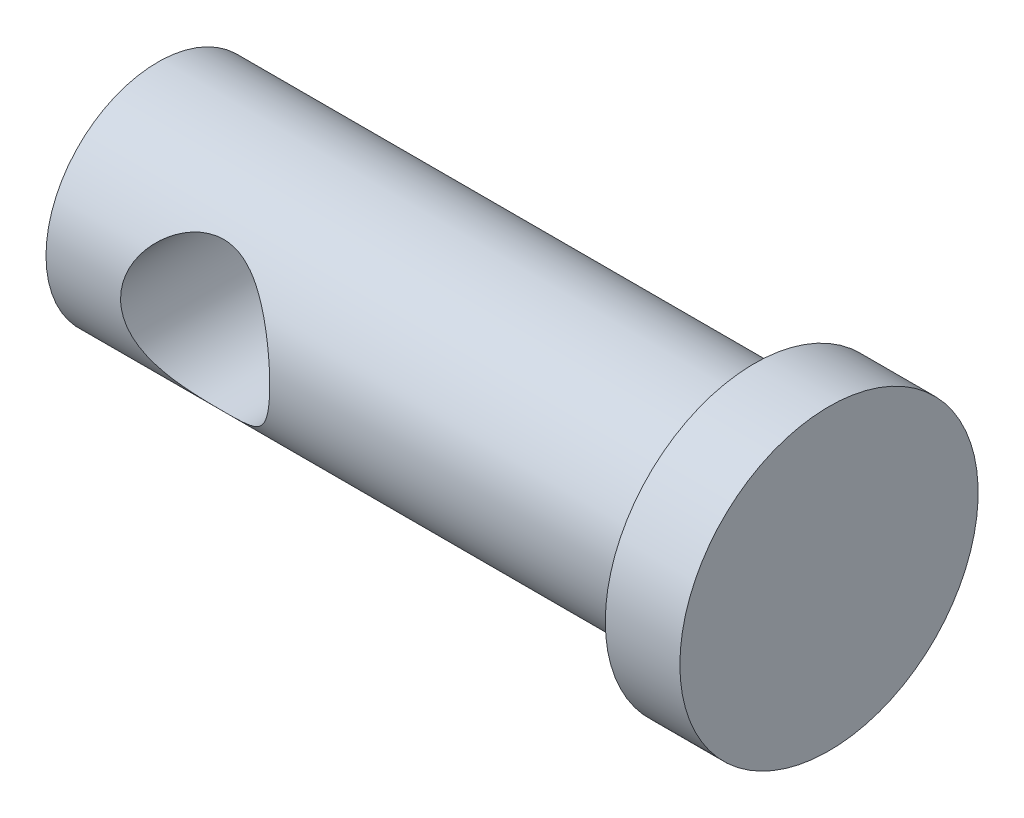
ISO-10303-21;
HEADER;
FILE_DESCRIPTION(('STEP AP214'),'2;1');
FILE_NAME('part.step','',(''),(''),'','','');
FILE_SCHEMA(('AUTOMOTIVE_DESIGN { 1 0 10303 214 1 1 1 1 }'));
ENDSEC;
DATA;
#1=APPLICATION_CONTEXT('core data for automotive mechanical design processes');
#2=APPLICATION_PROTOCOL_DEFINITION('international standard','automotive_design',2000,#1);
#3=PRODUCT_CONTEXT('',#1,'mechanical');
#4=PRODUCT('Part','Part','',(#3));
#5=PRODUCT_RELATED_PRODUCT_CATEGORY('part','',(#4));
#6=PRODUCT_DEFINITION_FORMATION('','',#4);
#7=PRODUCT_DEFINITION_CONTEXT('part definition',#1,'design');
#8=PRODUCT_DEFINITION('design','',#6,#7);
#9=PRODUCT_DEFINITION_SHAPE('','',#8);
#10=(LENGTH_UNIT() NAMED_UNIT(*) SI_UNIT(.MILLI.,.METRE.));
#11=(NAMED_UNIT(*) PLANE_ANGLE_UNIT() SI_UNIT($,.RADIAN.));
#12=(NAMED_UNIT(*) SI_UNIT($,.STERADIAN.) SOLID_ANGLE_UNIT());
#13=UNCERTAINTY_MEASURE_WITH_UNIT(LENGTH_MEASURE(1.E-05),#10,'distance_accuracy_value','');
#14=(GEOMETRIC_REPRESENTATION_CONTEXT(3) GLOBAL_UNCERTAINTY_ASSIGNED_CONTEXT((#13)) GLOBAL_UNIT_ASSIGNED_CONTEXT((#10,
#11,#12)) REPRESENTATION_CONTEXT('',''));
#15=CARTESIAN_POINT('',(0.,0.,0.));
#16=DIRECTION('',(0.,0.,1.));
#17=DIRECTION('',(1.,0.,0.));
#18=AXIS2_PLACEMENT_3D('',#15,#16,#17);
#19=CARTESIAN_POINT('',(0.,0.,0.));
#20=DIRECTION('',(-1.,0.,0.));
#21=DIRECTION('',(0.,0.,1.));
#22=AXIS2_PLACEMENT_3D('',#19,#20,#21);
#23=PLANE('',#22);
#24=CARTESIAN_POINT('',(0.,0.,0.));
#25=DIRECTION('',(-1.,0.,0.));
#26=DIRECTION('',(0.,0.,1.));
#27=AXIS2_PLACEMENT_3D('',#24,#25,#26);
#28=CIRCLE('',#27,2.);
#29=CARTESIAN_POINT('',(0.,0.,2.));
#30=VERTEX_POINT('',#29);
#31=EDGE_CURVE('E10',#30,#30,#28,.T.);
#32=ORIENTED_EDGE('',*,*,#31,.F.);
#33=EDGE_LOOP('',(#32));
#34=FACE_BOUND('',#33,.T.);
#35=ADVANCED_FACE('F43',(#34),#23,.F.);
#36=CARTESIAN_POINT('',(-9.,0.,0.));
#37=DIRECTION('',(-1.,0.,0.));
#38=DIRECTION('',(0.,0.,1.));
#39=AXIS2_PLACEMENT_3D('',#36,#37,#38);
#40=CYLINDRICAL_SURFACE('',#39,2.);
#41=CARTESIAN_POINT('',(-1.,0.,0.));
#42=DIRECTION('',(-1.,0.,0.));
#43=DIRECTION('',(0.,0.,1.));
#44=AXIS2_PLACEMENT_3D('',#41,#42,#43);
#45=CIRCLE('',#44,2.);
#46=CARTESIAN_POINT('',(-1.,0.,2.));
#47=VERTEX_POINT('',#46);
#48=EDGE_CURVE('E56',#47,#47,#45,.T.);
#49=ORIENTED_EDGE('',*,*,#48,.F.);
#50=EDGE_LOOP('',(#49));
#51=FACE_BOUND('',#50,.T.);
#52=ORIENTED_EDGE('',*,*,#31,.T.);
#53=EDGE_LOOP('',(#52));
#54=FACE_BOUND('',#53,.T.);
#55=ADVANCED_FACE('F91',(#51,#54),#40,.T.);
#56=CARTESIAN_POINT('',(-1.,2.,0.));
#57=DIRECTION('',(1.,0.,0.));
#58=DIRECTION('',(0.,0.,-1.));
#59=AXIS2_PLACEMENT_3D('',#56,#57,#58);
#60=PLANE('',#59);
#61=CARTESIAN_POINT('',(-1.,0.,0.));
#62=DIRECTION('',(-1.,0.,0.));
#63=DIRECTION('',(0.,0.,1.));
#64=AXIS2_PLACEMENT_3D('',#61,#62,#63);
#65=CIRCLE('',#64,1.5);
#66=CARTESIAN_POINT('',(-1.,0.,1.5));
#67=VERTEX_POINT('',#66);
#68=EDGE_CURVE('E62',#67,#67,#65,.T.);
#69=ORIENTED_EDGE('',*,*,#68,.F.);
#70=EDGE_LOOP('',(#69));
#71=FACE_BOUND('',#70,.T.);
#72=ORIENTED_EDGE('',*,*,#48,.T.);
#73=EDGE_LOOP('',(#72));
#74=FACE_BOUND('',#73,.T.);
#75=ADVANCED_FACE('F87',(#71,#74),#60,.F.);
#76=CARTESIAN_POINT('',(-9.,0.,0.));
#77=DIRECTION('',(-1.,0.,0.));
#78=DIRECTION('',(0.,0.,1.));
#79=AXIS2_PLACEMENT_3D('',#76,#77,#78);
#80=CYLINDRICAL_SURFACE('',#79,1.5);
#81=CARTESIAN_POINT('',(-6.,0.,1.5));
#82=CARTESIAN_POINT('',(-5.99999972518375,-0.050242358334064,1.50000020822414));
#83=CARTESIAN_POINT('',(-6.00380698497775,-0.100484543566457,1.49745401376692));
#84=CARTESIAN_POINT('',(-6.01879843205283,-0.199366529015833,1.48752326211906));
#85=CARTESIAN_POINT('',(-6.02998612156165,-0.248005556977501,1.48013640790618));
#86=CARTESIAN_POINT('',(-6.05905385866242,-0.342106153927126,1.46125241202353));
#87=CARTESIAN_POINT('',(-6.07690257000397,-0.387581436328777,1.44977452746657));
#88=CARTESIAN_POINT('',(-6.11853168163575,-0.474707645498629,1.4236306893872));
#89=CARTESIAN_POINT('',(-6.14231294315028,-0.516358015804834,1.40896427302755));
#90=CARTESIAN_POINT('',(-6.19732846868372,-0.598642350385054,1.37613664684919));
#91=CARTESIAN_POINT('',(-6.22902393037145,-0.638890152730337,1.3577844878966));
#92=CARTESIAN_POINT('',(-6.29786502432923,-0.713864022346369,1.31991156541733));
#93=CARTESIAN_POINT('',(-6.33501846491887,-0.748582027719439,1.30038915178416));
#94=CARTESIAN_POINT('',(-6.42052618380634,-0.81711148872748,1.25864132339397));
#95=CARTESIAN_POINT('',(-6.46972282660172,-0.849915931813755,1.23647533968899));
#96=CARTESIAN_POINT('',(-6.57418168882327,-0.906751785070868,1.19542073676408));
#97=CARTESIAN_POINT('',(-6.62943320078139,-0.930798367132494,1.17652647977327));
#98=CARTESIAN_POINT('',(-6.7283556467108,-0.963370175057203,1.14988133320735));
#99=CARTESIAN_POINT('',(-6.77076422643691,-0.974372236180082,1.14048813946218));
#100=CARTESIAN_POINT('',(-6.85737225237087,-0.9907530889261,1.12628984829786));
#101=CARTESIAN_POINT('',(-6.90156847436319,-0.99614157325966,1.12147684372013));
#102=CARTESIAN_POINT('',(-6.99073738942808,-1.00095682070629,1.11718302804083));
#103=CARTESIAN_POINT('',(-7.0357125117256,-1.0003592145882,1.11772401279478));
#104=CARTESIAN_POINT('',(-7.12481748675048,-0.993187906666194,1.12409887741485));
#105=CARTESIAN_POINT('',(-7.16894659101632,-0.986609141899783,1.12993724142592));
#106=CARTESIAN_POINT('',(-7.25323352561879,-0.968324971088712,1.14563592995791));
#107=CARTESIAN_POINT('',(-7.29348066796153,-0.956858557405003,1.15530744165153));
#108=CARTESIAN_POINT('',(-7.37151184549576,-0.929350592909501,1.17754811463845));
#109=CARTESIAN_POINT('',(-7.40929506514863,-0.913307536614354,1.19011822916388));
#110=CARTESIAN_POINT('',(-7.48951269764114,-0.873369093698318,1.21982098202212));
#111=CARTESIAN_POINT('',(-7.53132995009406,-0.848540261643842,1.23736158924507));
#112=CARTESIAN_POINT('',(-7.61069169749191,-0.793344802336528,1.27345768922483));
#113=CARTESIAN_POINT('',(-7.64823082883713,-0.762971345040337,1.29201441370946));
#114=CARTESIAN_POINT('',(-7.72627127285557,-0.689905826559709,1.33271671862096));
#115=CARTESIAN_POINT('',(-7.7656670243557,-0.645969691404497,1.35477372355024));
#116=CARTESIAN_POINT('',(-7.83659824725494,-0.551003999553807,1.39609050337857));
#117=CARTESIAN_POINT('',(-7.86814107270105,-0.499981149675161,1.41535288825285));
#118=CARTESIAN_POINT('',(-7.91673885931421,-0.402428913545598,1.44572702044166));
#119=CARTESIAN_POINT('',(-7.93542168167021,-0.356978821685239,1.45769630582498));
#120=CARTESIAN_POINT('',(-7.96605246281194,-0.263018021968452,1.47753859515521));
#121=CARTESIAN_POINT('',(-7.97800611356591,-0.214509939501016,1.48541506063844));
#122=CARTESIAN_POINT('',(-7.9945805826192,-0.115492726585945,1.49637941078331));
#123=CARTESIAN_POINT('',(-7.99916973046918,-0.0649759059670213,1.49944661230576));
#124=CARTESIAN_POINT('',(-8.00062354428105,0.036220759694619,1.50041557482591));
#125=CARTESIAN_POINT('',(-7.99748875024439,0.0869005930932839,1.49831769692815));
#126=CARTESIAN_POINT('',(-7.98418797221902,0.183227858602149,1.48949794712138));
#127=CARTESIAN_POINT('',(-7.97453135112234,0.228978722339657,1.48311123195135));
#128=CARTESIAN_POINT('',(-7.94920215699362,0.318058196213642,1.46659224642396));
#129=CARTESIAN_POINT('',(-7.9335286245361,0.361386418785357,1.45645937873408));
#130=CARTESIAN_POINT('',(-7.89567385147732,0.447332375233223,1.4324817626467));
#131=CARTESIAN_POINT('',(-7.87315592295824,0.489748092316566,1.41844935068245));
#132=CARTESIAN_POINT('',(-7.8227833550277,0.570341511977792,1.38800927805403));
#133=CARTESIAN_POINT('',(-7.79492541973703,0.608516574097257,1.37160015200651));
#134=CARTESIAN_POINT('',(-7.72969606591763,0.685927227415325,1.33477273328242));
#135=CARTESIAN_POINT('',(-7.69151686994798,0.724375937862667,1.31413078406202));
#136=CARTESIAN_POINT('',(-7.60944428503593,0.794669840332394,1.27285586536854));
#137=CARTESIAN_POINT('',(-7.5655469805006,0.826510468230435,1.25222291185946));
#138=CARTESIAN_POINT('',(-7.4764287935708,0.880623882794764,1.21469839506517));
#139=CARTESIAN_POINT('',(-7.43163398310014,0.903478180804395,1.19763798588661));
#140=CARTESIAN_POINT('',(-7.33806367360943,0.942481068876252,1.16719487207113));
#141=CARTESIAN_POINT('',(-7.2892955308023,0.958641728453859,1.1538055628277));
#142=CARTESIAN_POINT('',(-7.19771775643295,0.981179217293119,1.13466604076532));
#143=CARTESIAN_POINT('',(-7.15541409507053,0.988792987823092,1.12797499006895));
#144=CARTESIAN_POINT('',(-7.06971335933228,0.998496029624887,1.11939733222928));
#145=CARTESIAN_POINT('',(-7.02631752442677,1.00059130142516,1.11750550674066));
#146=CARTESIAN_POINT('',(-6.93967847164164,0.999119609907757,1.11882100574833));
#147=CARTESIAN_POINT('',(-6.89643535931854,0.995549293852656,1.12203134956833));
#148=CARTESIAN_POINT('',(-6.81132823572852,0.982984986109971,1.1330522619864));
#149=CARTESIAN_POINT('',(-6.76946614306962,0.97398375858765,1.14086896751217));
#150=CARTESIAN_POINT('',(-6.67714440678569,0.947965178356308,1.1626342196827));
#151=CARTESIAN_POINT('',(-6.62736614363047,0.929450935941993,1.17766166854602));
#152=CARTESIAN_POINT('',(-6.53225658291059,0.885422631474873,1.21111080629161));
#153=CARTESIAN_POINT('',(-6.48693165103157,0.85989874178542,1.22953724861882));
#154=CARTESIAN_POINT('',(-6.40035905640316,0.801991402694657,1.26808593269725));
#155=CARTESIAN_POINT('',(-6.35920062728075,0.769491549448271,1.2882329369107));
#156=CARTESIAN_POINT('',(-6.28233876087877,0.698358840177308,1.32814150773993));
#157=CARTESIAN_POINT('',(-6.24663700148759,0.659724105134951,1.3479029541764));
#158=CARTESIAN_POINT('',(-6.17664394784294,0.570728664877768,1.38815775980392));
#159=CARTESIAN_POINT('',(-6.14329067991017,0.519480834775986,1.40834902724558));
#160=CARTESIAN_POINT('',(-6.08604336166802,0.410434277887489,1.44388832937518));
#161=CARTESIAN_POINT('',(-6.06213444658818,0.352646031225022,1.45924396722731));
#162=CARTESIAN_POINT('',(-6.02942271091799,0.245717534917525,1.48050822418367));
#163=CARTESIAN_POINT('',(-6.01844448045066,0.197506162628867,1.48775740184446));
#164=CARTESIAN_POINT('',(-6.00373598373099,0.0995290060120649,1.49750140070948));
#165=CARTESIAN_POINT('',(-6.000000272202,0.0497644180940285,1.49999979375663));
#166=CARTESIAN_POINT('',(-6.,0.,1.5));
#167=B_SPLINE_CURVE_WITH_KNOTS('',3,(#81,#82,#83,#84,#85,#86,#87,#88,#89,#90,#91,#92,#93,#94,
#95,#96,#97,#98,#99,#100,#101,#102,#103,#104,#105,#106,#107,#108,#109,#110,#111,#112,#113,#114,
#115,#116,#117,#118,#119,#120,#121,#122,#123,#124,#125,#126,#127,#128,#129,#130,#131,#132,#133,
#134,#135,#136,#137,#138,#139,#140,#141,#142,#143,#144,#145,#146,#147,#148,#149,#150,#151,#152,
#153,#154,#155,#156,#157,#158,#159,#160,#161,#162,#163,#164,#165,#166),.UNSPECIFIED.,.T.,.F.,(4,
2,2,2,2,2,2,2,2,2,2,2,2,2,2,2,2,2,2,2,2,2,2,2,2,2,2,2,2,2,2,2,2,2,2,2,2,2,2,2,2,2,4),(0.,
0.1505266132527,0.301124707174344,0.451023076595115,0.600943219336932,0.763585145002783,
0.926462058021592,1.11503341647991,1.30327652722719,1.43716846838015,1.57082883922905,
1.70503355867689,1.83935198631676,1.96774431099011,2.09617891902539,2.25073787329797,
2.40548851889212,2.5935947724756,2.78152420149865,2.93262043847563,3.08358867570591,
3.23520441646309,3.38680955765891,3.5277654239542,3.66874377568319,3.81826173413942,
3.96787227471786,4.1411408806983,4.31452876587063,4.47324967649701,4.63168313315306,
4.76162024003012,4.8914160016149,5.02128860137217,5.15133461921144,5.31603304346011,
5.48096356682587,5.64889622595852,5.81688041978686,6.00897675773024,6.20076953274023,
6.34997645676982,6.49907115623393),.UNSPECIFIED.);
#168=CARTESIAN_POINT('',(-6.,0.,1.5));
#169=VERTEX_POINT('',#168);
#170=EDGE_CURVE('E46',#169,#169,#167,.T.);
#171=ORIENTED_EDGE('',*,*,#170,.T.);
#172=EDGE_LOOP('',(#171));
#173=FACE_BOUND('',#172,.T.);
#174=CARTESIAN_POINT('',(-6.,0.,-1.5));
#175=CARTESIAN_POINT('',(-5.99999972518375,0.050242358334064,-1.50000020822414));
#176=CARTESIAN_POINT('',(-6.00380698497775,0.100484543566457,-1.49745401376692));
#177=CARTESIAN_POINT('',(-6.01879843205283,0.199366529015833,-1.48752326211906));
#178=CARTESIAN_POINT('',(-6.02998612156165,0.248005556977501,-1.48013640790618));
#179=CARTESIAN_POINT('',(-6.05905385866242,0.342106153927126,-1.46125241202353));
#180=CARTESIAN_POINT('',(-6.07690257000397,0.387581436328777,-1.44977452746657));
#181=CARTESIAN_POINT('',(-6.11853168163575,0.474707645498629,-1.4236306893872));
#182=CARTESIAN_POINT('',(-6.14231294315028,0.516358015804834,-1.40896427302755));
#183=CARTESIAN_POINT('',(-6.19732846868372,0.598642350385054,-1.37613664684919));
#184=CARTESIAN_POINT('',(-6.22902393037145,0.638890152730337,-1.3577844878966));
#185=CARTESIAN_POINT('',(-6.29786502432923,0.713864022346369,-1.31991156541733));
#186=CARTESIAN_POINT('',(-6.33501846491887,0.748582027719439,-1.30038915178416));
#187=CARTESIAN_POINT('',(-6.42052618380634,0.81711148872748,-1.25864132339397));
#188=CARTESIAN_POINT('',(-6.46972282660172,0.849915931813755,-1.23647533968899));
#189=CARTESIAN_POINT('',(-6.57418168882327,0.906751785070868,-1.19542073676408));
#190=CARTESIAN_POINT('',(-6.62943320078139,0.930798367132494,-1.17652647977327));
#191=CARTESIAN_POINT('',(-6.7283556467108,0.963370175057203,-1.14988133320735));
#192=CARTESIAN_POINT('',(-6.77076422643691,0.974372236180082,-1.14048813946218));
#193=CARTESIAN_POINT('',(-6.85737225237087,0.9907530889261,-1.12628984829786));
#194=CARTESIAN_POINT('',(-6.90156847436319,0.99614157325966,-1.12147684372013));
#195=CARTESIAN_POINT('',(-6.99073738942808,1.00095682070629,-1.11718302804083));
#196=CARTESIAN_POINT('',(-7.0357125117256,1.0003592145882,-1.11772401279478));
#197=CARTESIAN_POINT('',(-7.12481748675048,0.993187906666194,-1.12409887741485));
#198=CARTESIAN_POINT('',(-7.16894659101632,0.986609141899783,-1.12993724142592));
#199=CARTESIAN_POINT('',(-7.25323352561879,0.968324971088712,-1.14563592995791));
#200=CARTESIAN_POINT('',(-7.29348066796153,0.956858557405003,-1.15530744165153));
#201=CARTESIAN_POINT('',(-7.37151184549576,0.929350592909501,-1.17754811463845));
#202=CARTESIAN_POINT('',(-7.40929506514863,0.913307536614354,-1.19011822916388));
#203=CARTESIAN_POINT('',(-7.48951269764114,0.873369093698318,-1.21982098202212));
#204=CARTESIAN_POINT('',(-7.53132995009406,0.848540261643842,-1.23736158924507));
#205=CARTESIAN_POINT('',(-7.61069169749191,0.793344802336528,-1.27345768922483));
#206=CARTESIAN_POINT('',(-7.64823082883713,0.762971345040337,-1.29201441370946));
#207=CARTESIAN_POINT('',(-7.72627127285557,0.689905826559709,-1.33271671862096));
#208=CARTESIAN_POINT('',(-7.7656670243557,0.645969691404497,-1.35477372355024));
#209=CARTESIAN_POINT('',(-7.83659824725494,0.551003999553807,-1.39609050337857));
#210=CARTESIAN_POINT('',(-7.86814107270105,0.499981149675161,-1.41535288825285));
#211=CARTESIAN_POINT('',(-7.91673885931421,0.402428913545598,-1.44572702044166));
#212=CARTESIAN_POINT('',(-7.93542168167021,0.356978821685239,-1.45769630582498));
#213=CARTESIAN_POINT('',(-7.96605246281194,0.263018021968452,-1.47753859515521));
#214=CARTESIAN_POINT('',(-7.97800611356591,0.214509939501016,-1.48541506063844));
#215=CARTESIAN_POINT('',(-7.9945805826192,0.115492726585945,-1.49637941078331));
#216=CARTESIAN_POINT('',(-7.99916973046918,0.0649759059670213,-1.49944661230576));
#217=CARTESIAN_POINT('',(-8.00062354428105,-0.036220759694619,-1.50041557482591));
#218=CARTESIAN_POINT('',(-7.99748875024439,-0.0869005930932839,-1.49831769692815));
#219=CARTESIAN_POINT('',(-7.98418797221902,-0.183227858602149,-1.48949794712138));
#220=CARTESIAN_POINT('',(-7.97453135112234,-0.228978722339657,-1.48311123195135));
#221=CARTESIAN_POINT('',(-7.94920215699362,-0.318058196213642,-1.46659224642396));
#222=CARTESIAN_POINT('',(-7.9335286245361,-0.361386418785357,-1.45645937873408));
#223=CARTESIAN_POINT('',(-7.89567385147732,-0.447332375233223,-1.4324817626467));
#224=CARTESIAN_POINT('',(-7.87315592295824,-0.489748092316566,-1.41844935068245));
#225=CARTESIAN_POINT('',(-7.8227833550277,-0.570341511977792,-1.38800927805403));
#226=CARTESIAN_POINT('',(-7.79492541973703,-0.608516574097257,-1.37160015200651));
#227=CARTESIAN_POINT('',(-7.72969606591763,-0.685927227415325,-1.33477273328242));
#228=CARTESIAN_POINT('',(-7.69151686994798,-0.724375937862667,-1.31413078406202));
#229=CARTESIAN_POINT('',(-7.60944428503593,-0.794669840332394,-1.27285586536854));
#230=CARTESIAN_POINT('',(-7.5655469805006,-0.826510468230435,-1.25222291185946));
#231=CARTESIAN_POINT('',(-7.4764287935708,-0.880623882794764,-1.21469839506517));
#232=CARTESIAN_POINT('',(-7.43163398310014,-0.903478180804395,-1.19763798588661));
#233=CARTESIAN_POINT('',(-7.33806367360943,-0.942481068876252,-1.16719487207113));
#234=CARTESIAN_POINT('',(-7.2892955308023,-0.958641728453859,-1.1538055628277));
#235=CARTESIAN_POINT('',(-7.19771775643295,-0.981179217293119,-1.13466604076532));
#236=CARTESIAN_POINT('',(-7.15541409507053,-0.988792987823092,-1.12797499006895));
#237=CARTESIAN_POINT('',(-7.06971335933228,-0.998496029624887,-1.11939733222928));
#238=CARTESIAN_POINT('',(-7.02631752442677,-1.00059130142516,-1.11750550674066));
#239=CARTESIAN_POINT('',(-6.93967847164164,-0.999119609907757,-1.11882100574833));
#240=CARTESIAN_POINT('',(-6.89643535931854,-0.995549293852656,-1.12203134956833));
#241=CARTESIAN_POINT('',(-6.81132823572852,-0.982984986109971,-1.1330522619864));
#242=CARTESIAN_POINT('',(-6.76946614306962,-0.97398375858765,-1.14086896751217));
#243=CARTESIAN_POINT('',(-6.67714440678569,-0.947965178356308,-1.1626342196827));
#244=CARTESIAN_POINT('',(-6.62736614363047,-0.929450935941993,-1.17766166854602));
#245=CARTESIAN_POINT('',(-6.53225658291059,-0.885422631474873,-1.21111080629161));
#246=CARTESIAN_POINT('',(-6.48693165103157,-0.85989874178542,-1.22953724861882));
#247=CARTESIAN_POINT('',(-6.40035905640316,-0.801991402694657,-1.26808593269725));
#248=CARTESIAN_POINT('',(-6.35920062728075,-0.769491549448271,-1.2882329369107));
#249=CARTESIAN_POINT('',(-6.28233876087877,-0.698358840177308,-1.32814150773993));
#250=CARTESIAN_POINT('',(-6.24663700148759,-0.659724105134951,-1.3479029541764));
#251=CARTESIAN_POINT('',(-6.17664394784294,-0.570728664877768,-1.38815775980392));
#252=CARTESIAN_POINT('',(-6.14329067991017,-0.519480834775986,-1.40834902724558));
#253=CARTESIAN_POINT('',(-6.08604336166802,-0.410434277887489,-1.44388832937518));
#254=CARTESIAN_POINT('',(-6.06213444658818,-0.352646031225022,-1.45924396722731));
#255=CARTESIAN_POINT('',(-6.02942271091799,-0.245717534917525,-1.48050822418367));
#256=CARTESIAN_POINT('',(-6.01844448045066,-0.197506162628867,-1.48775740184446));
#257=CARTESIAN_POINT('',(-6.00373598373099,-0.0995290060120649,-1.49750140070948));
#258=CARTESIAN_POINT('',(-6.000000272202,-0.0497644180940285,-1.49999979375663));
#259=CARTESIAN_POINT('',(-6.,0.,-1.5));
#260=B_SPLINE_CURVE_WITH_KNOTS('',3,(#174,#175,#176,#177,#178,#179,#180,#181,#182,#183,#184,
#185,#186,#187,#188,#189,#190,#191,#192,#193,#194,#195,#196,#197,#198,#199,#200,#201,#202,#203,
#204,#205,#206,#207,#208,#209,#210,#211,#212,#213,#214,#215,#216,#217,#218,#219,#220,#221,#222,
#223,#224,#225,#226,#227,#228,#229,#230,#231,#232,#233,#234,#235,#236,#237,#238,#239,#240,#241,
#242,#243,#244,#245,#246,#247,#248,#249,#250,#251,#252,#253,#254,#255,#256,#257,#258,#259),
.UNSPECIFIED.,.T.,.F.,(4,2,2,2,2,2,2,2,2,2,2,2,2,2,2,2,2,2,2,2,2,2,2,2,2,2,2,2,2,2,2,2,2,2,2,2,
2,2,2,2,2,2,4),(0.,0.1505266132527,0.301124707174344,0.451023076595115,0.600943219336932,
0.763585145002783,0.926462058021592,1.11503341647991,1.30327652722719,1.43716846838015,
1.57082883922905,1.70503355867689,1.83935198631676,1.96774431099011,2.09617891902539,
2.25073787329797,2.40548851889212,2.5935947724756,2.78152420149865,2.93262043847563,
3.08358867570591,3.23520441646309,3.38680955765891,3.5277654239542,3.66874377568319,
3.81826173413942,3.96787227471786,4.1411408806983,4.31452876587063,4.47324967649701,
4.63168313315306,4.76162024003012,4.8914160016149,5.02128860137217,5.15133461921144,
5.31603304346011,5.48096356682587,5.64889622595852,5.81688041978686,6.00897675773024,
6.20076953274023,6.34997645676982,6.49907115623393),.UNSPECIFIED.);
#261=CARTESIAN_POINT('',(-6.,0.,-1.5));
#262=VERTEX_POINT('',#261);
#263=EDGE_CURVE('E65',#262,#262,#260,.T.);
#264=ORIENTED_EDGE('',*,*,#263,.T.);
#265=EDGE_LOOP('',(#264));
#266=FACE_BOUND('',#265,.T.);
#267=CARTESIAN_POINT('',(-9.,0.,0.));
#268=DIRECTION('',(-1.,0.,0.));
#269=DIRECTION('',(0.,0.,1.));
#270=AXIS2_PLACEMENT_3D('',#267,#268,#269);
#271=CIRCLE('',#270,1.5);
#272=CARTESIAN_POINT('',(-9.,0.,1.5));
#273=VERTEX_POINT('',#272);
#274=EDGE_CURVE('E108',#273,#273,#271,.T.);
#275=ORIENTED_EDGE('',*,*,#274,.F.);
#276=EDGE_LOOP('',(#275));
#277=FACE_BOUND('',#276,.T.);
#278=ORIENTED_EDGE('',*,*,#68,.T.);
#279=EDGE_LOOP('',(#278));
#280=FACE_BOUND('',#279,.T.);
#281=ADVANCED_FACE('F71',(#173,#266,#277,#280),#80,.T.);
#282=CARTESIAN_POINT('',(-9.,1.5,0.));
#283=DIRECTION('',(1.,0.,0.));
#284=DIRECTION('',(0.,0.,-1.));
#285=AXIS2_PLACEMENT_3D('',#282,#283,#284);
#286=PLANE('',#285);
#287=ORIENTED_EDGE('',*,*,#274,.T.);
#288=EDGE_LOOP('',(#287));
#289=FACE_BOUND('',#288,.T.);
#290=ADVANCED_FACE('F78',(#289),#286,.F.);
#291=CARTESIAN_POINT('',(-7.,0.,-2.));
#292=DIRECTION('',(0.,0.,1.));
#293=DIRECTION('',(1.,0.,0.));
#294=AXIS2_PLACEMENT_3D('',#291,#292,#293);
#295=CYLINDRICAL_SURFACE('',#294,1.);
#296=ORIENTED_EDGE('',*,*,#263,.F.);
#297=EDGE_LOOP('',(#296));
#298=FACE_BOUND('',#297,.T.);
#299=ORIENTED_EDGE('',*,*,#170,.F.);
#300=EDGE_LOOP('',(#299));
#301=FACE_BOUND('',#300,.T.);
#302=ADVANCED_FACE('F75',(#298,#301),#295,.F.);
#303=CLOSED_SHELL('',(#35,#55,#75,#281,#290,#302));
#304=MANIFOLD_SOLID_BREP('B2',#303);
#305=ADVANCED_BREP_SHAPE_REPRESENTATION('',(#18,#304),#14);
#306=SHAPE_DEFINITION_REPRESENTATION(#9,#305);
ENDSEC;
END-ISO-10303-21;
